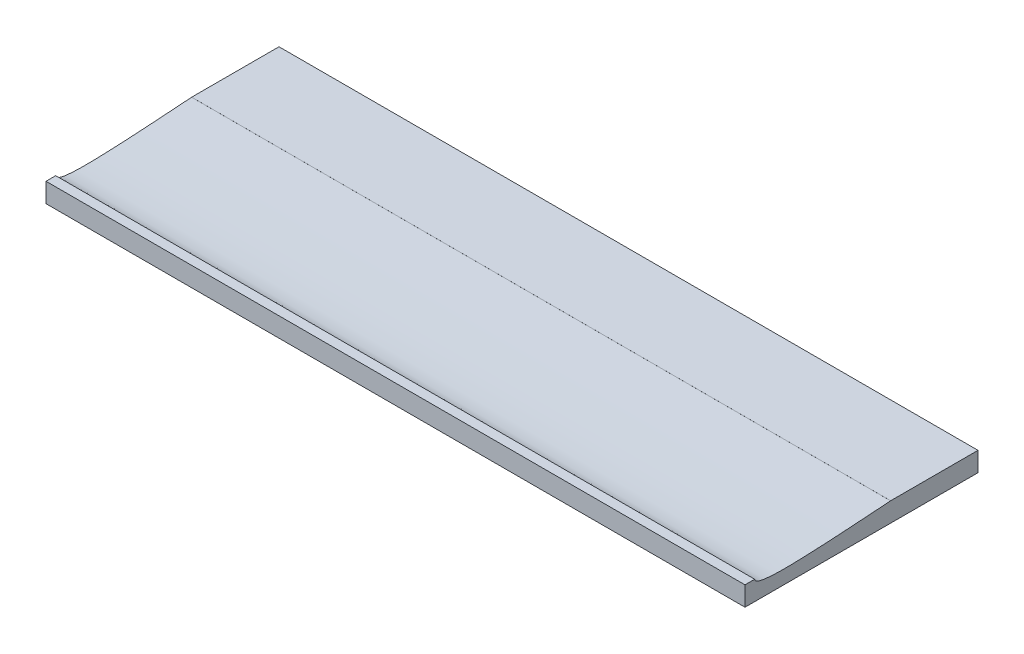
ISO-10303-21;
HEADER;
FILE_DESCRIPTION(('STEP AP214'),'2;1');
FILE_NAME('part.step','',(''),(''),'','','');
FILE_SCHEMA(('AUTOMOTIVE_DESIGN { 1 0 10303 214 1 1 1 1 }'));
ENDSEC;
DATA;
#1=APPLICATION_CONTEXT('core data for automotive mechanical design processes');
#2=APPLICATION_PROTOCOL_DEFINITION('international standard','automotive_design',2000,#1);
#3=PRODUCT_CONTEXT('',#1,'mechanical');
#4=PRODUCT('Part','Part','',(#3));
#5=PRODUCT_RELATED_PRODUCT_CATEGORY('part','',(#4));
#6=PRODUCT_DEFINITION_FORMATION('','',#4);
#7=PRODUCT_DEFINITION_CONTEXT('part definition',#1,'design');
#8=PRODUCT_DEFINITION('design','',#6,#7);
#9=PRODUCT_DEFINITION_SHAPE('','',#8);
#10=(LENGTH_UNIT() NAMED_UNIT(*) SI_UNIT(.MILLI.,.METRE.));
#11=(NAMED_UNIT(*) PLANE_ANGLE_UNIT() SI_UNIT($,.RADIAN.));
#12=(NAMED_UNIT(*) SI_UNIT($,.STERADIAN.) SOLID_ANGLE_UNIT());
#13=UNCERTAINTY_MEASURE_WITH_UNIT(LENGTH_MEASURE(1.E-05),#10,'distance_accuracy_value','');
#14=(GEOMETRIC_REPRESENTATION_CONTEXT(3) GLOBAL_UNCERTAINTY_ASSIGNED_CONTEXT((#13)) GLOBAL_UNIT_ASSIGNED_CONTEXT((#10,
#11,#12)) REPRESENTATION_CONTEXT('',''));
#15=CARTESIAN_POINT('',(0.,0.,0.));
#16=DIRECTION('',(0.,0.,1.));
#17=DIRECTION('',(1.,0.,0.));
#18=AXIS2_PLACEMENT_3D('',#15,#16,#17);
#19=CARTESIAN_POINT('',(0.,0.,0.));
#20=DIRECTION('',(0.,1.,0.));
#21=DIRECTION('',(0.,0.,1.));
#22=AXIS2_PLACEMENT_3D('',#19,#20,#21);
#23=PLANE('',#22);
#24=DIRECTION('',(0.,0.,1.));
#25=VECTOR('',#24,1.);
#26=CARTESIAN_POINT('',(-914.4,0.,0.));
#27=LINE('',#26,#25);
#28=CARTESIAN_POINT('',(-914.4,0.,0.));
#29=VERTEX_POINT('',#28);
#30=CARTESIAN_POINT('',(-914.4,0.,25.4));
#31=VERTEX_POINT('',#30);
#32=EDGE_CURVE('E176',#29,#31,#27,.T.);
#33=ORIENTED_EDGE('',*,*,#32,.T.);
#34=DIRECTION('',(1.,0.,0.));
#35=VECTOR('',#34,1.);
#36=CARTESIAN_POINT('',(914.4,0.,25.4));
#37=LINE('',#36,#35);
#38=CARTESIAN_POINT('',(914.4,0.,25.4));
#39=VERTEX_POINT('',#38);
#40=EDGE_CURVE('E174',#31,#39,#37,.T.);
#41=ORIENTED_EDGE('',*,*,#40,.T.);
#42=DIRECTION('',(0.,0.,1.));
#43=VECTOR('',#42,1.);
#44=CARTESIAN_POINT('',(914.4,0.,0.));
#45=LINE('',#44,#43);
#46=CARTESIAN_POINT('',(914.4,0.,0.));
#47=VERTEX_POINT('',#46);
#48=EDGE_CURVE('E90',#47,#39,#45,.T.);
#49=ORIENTED_EDGE('',*,*,#48,.F.);
#50=DIRECTION('',(-1.,0.,0.));
#51=VECTOR('',#50,1.);
#52=CARTESIAN_POINT('',(914.4,0.,0.));
#53=LINE('',#52,#51);
#54=EDGE_CURVE('E108',#29,#47,#53,.F.);
#55=ORIENTED_EDGE('',*,*,#54,.F.);
#56=EDGE_LOOP('',(#33,#41,#49,#55));
#57=FACE_BOUND('',#56,.T.);
#58=ADVANCED_FACE('F43',(#57),#23,.T.);
#59=CARTESIAN_POINT('',(914.4,0.,-584.2));
#60=VERTEX_POINT('',#59);
#61=CARTESIAN_POINT('',(914.4,0.,-355.6));
#62=VERTEX_POINT('',#61);
#63=EDGE_CURVE('E159',#60,#62,#45,.T.);
#64=ORIENTED_EDGE('',*,*,#63,.F.);
#65=DIRECTION('',(-1.,0.,0.));
#66=VECTOR('',#65,1.);
#67=CARTESIAN_POINT('',(914.4,0.,-584.2));
#68=LINE('',#67,#66);
#69=CARTESIAN_POINT('',(-914.4,0.,-584.2));
#70=VERTEX_POINT('',#69);
#71=EDGE_CURVE('E163',#60,#70,#68,.T.);
#72=ORIENTED_EDGE('',*,*,#71,.T.);
#73=CARTESIAN_POINT('',(-914.4,0.,-355.6));
#74=VERTEX_POINT('',#73);
#75=EDGE_CURVE('E169',#70,#74,#27,.T.);
#76=ORIENTED_EDGE('',*,*,#75,.T.);
#77=DIRECTION('',(-1.,0.,0.));
#78=VECTOR('',#77,1.);
#79=CARTESIAN_POINT('',(914.4,0.,-355.6));
#80=LINE('',#79,#78);
#81=EDGE_CURVE('E104',#62,#74,#80,.T.);
#82=ORIENTED_EDGE('',*,*,#81,.F.);
#83=EDGE_LOOP('',(#64,#72,#76,#82));
#84=FACE_BOUND('',#83,.T.);
#85=ADVANCED_FACE('F137',(#84),#23,.T.);
#86=CARTESIAN_POINT('',(914.4,-50.8,25.4));
#87=DIRECTION('',(0.,1.,0.));
#88=DIRECTION('',(0.,0.,1.));
#89=AXIS2_PLACEMENT_3D('',#86,#87,#88);
#90=PLANE('',#89);
#91=DIRECTION('',(0.,0.,-1.));
#92=VECTOR('',#91,1.);
#93=CARTESIAN_POINT('',(-914.4,-50.8,25.4));
#94=LINE('',#93,#92);
#95=CARTESIAN_POINT('',(-914.4,-50.8,25.4));
#96=VERTEX_POINT('',#95);
#97=CARTESIAN_POINT('',(-914.4,-50.8,-584.2));
#98=VERTEX_POINT('',#97);
#99=EDGE_CURVE('E111',#96,#98,#94,.T.);
#100=ORIENTED_EDGE('',*,*,#99,.T.);
#101=DIRECTION('',(-1.,0.,0.));
#102=VECTOR('',#101,1.);
#103=CARTESIAN_POINT('',(914.4,-50.8,-584.2));
#104=LINE('',#103,#102);
#105=CARTESIAN_POINT('',(914.4,-50.8,-584.2));
#106=VERTEX_POINT('',#105);
#107=EDGE_CURVE('E99',#106,#98,#104,.T.);
#108=ORIENTED_EDGE('',*,*,#107,.F.);
#109=DIRECTION('',(0.,0.,-1.));
#110=VECTOR('',#109,1.);
#111=CARTESIAN_POINT('',(914.4,-50.8,25.4));
#112=LINE('',#111,#110);
#113=CARTESIAN_POINT('',(914.4,-50.8,25.4));
#114=VERTEX_POINT('',#113);
#115=EDGE_CURVE('E85',#114,#106,#112,.T.);
#116=ORIENTED_EDGE('',*,*,#115,.F.);
#117=DIRECTION('',(-1.,0.,0.));
#118=VECTOR('',#117,1.);
#119=CARTESIAN_POINT('',(914.4,-50.8,25.4));
#120=LINE('',#119,#118);
#121=EDGE_CURVE('E97',#114,#96,#120,.T.);
#122=ORIENTED_EDGE('',*,*,#121,.T.);
#123=EDGE_LOOP('',(#100,#108,#116,#122));
#124=FACE_BOUND('',#123,.T.);
#125=ADVANCED_FACE('F96',(#124),#90,.F.);
#126=CARTESIAN_POINT('',(914.4,0.0888999932646485,-355.599995778429));
#127=CARTESIAN_POINT('',(914.4,0.484485581174474,-353.719919627978));
#128=CARTESIAN_POINT('',(914.4,1.27499422878835,-349.962916085565));
#129=CARTESIAN_POINT('',(914.4,2.40827403380004,-344.321357203808));
#130=CARTESIAN_POINT('',(914.4,3.51224428554685,-338.683668582805));
#131=CARTESIAN_POINT('',(914.4,4.58778598690869,-333.050236725864));
#132=CARTESIAN_POINT('',(914.4,5.63943265471717,-327.422693692191));
#133=CARTESIAN_POINT('',(914.4,6.66885796095019,-321.802334741478));
#134=CARTESIAN_POINT('',(914.4,8.01138509570149,-314.329135268456));
#135=CARTESIAN_POINT('',(914.4,9.95842272173463,-303.170369870886));
#136=CARTESIAN_POINT('',(914.4,12.1073580768191,-290.19428736061));
#137=CARTESIAN_POINT('',(914.4,14.1187486911346,-277.289771757418));
#138=CARTESIAN_POINT('',(914.4,15.7391510638879,-266.32724231001));
#139=CARTESIAN_POINT('',(914.4,17.7534444628226,-251.907291760423));
#140=CARTESIAN_POINT('',(914.4,19.5782384305861,-237.620805882297));
#141=CARTESIAN_POINT('',(914.4,21.2212030126759,-223.484571154683));
#142=CARTESIAN_POINT('',(914.4,22.3524467404894,-213.079958676204));
#143=CARTESIAN_POINT('',(914.4,23.3907772480329,-202.818953541216));
#144=CARTESIAN_POINT('',(914.4,24.3352201311702,-192.711844060908));
#145=CARTESIAN_POINT('',(914.4,25.1831580524957,-182.768771906038));
#146=CARTESIAN_POINT('',(914.4,25.9306382458563,-172.999706974309));
#147=CARTESIAN_POINT('',(914.4,26.6759749048506,-161.875503699859));
#148=CARTESIAN_POINT('',(914.4,27.3461189359201,-149.491704209398));
#149=CARTESIAN_POINT('',(914.4,27.8403999086836,-135.95080921462));
#150=CARTESIAN_POINT('',(914.4,28.0598914946158,-122.90686374129));
#151=CARTESIAN_POINT('',(914.4,28.000634334178,-110.389557420167));
#152=CARTESIAN_POINT('',(914.4,27.7009853530257,-99.6722079382337));
#153=CARTESIAN_POINT('',(914.4,27.2622927992727,-90.6679719817907));
#154=CARTESIAN_POINT('',(914.4,26.7758575923483,-83.2799929778685));
#155=CARTESIAN_POINT('',(914.4,26.1810853849601,-76.1661794314949));
#156=CARTESIAN_POINT('',(914.4,25.4836516885047,-69.3336988676735));
#157=CARTESIAN_POINT('',(914.4,24.689671340475,-62.7894248802562));
#158=CARTESIAN_POINT('',(914.4,23.8055575461834,-56.5399161880709));
#159=CARTESIAN_POINT('',(914.4,22.8379106465937,-50.5914339032072));
#160=CARTESIAN_POINT('',(914.4,21.7934994750107,-44.9499525321036));
#161=CARTESIAN_POINT('',(914.4,20.6792785482356,-39.6211129124822));
#162=CARTESIAN_POINT('',(914.4,19.6842791067834,-35.3845979102347));
#163=CARTESIAN_POINT('',(914.4,18.666344517664,-31.4108424021032));
#164=CARTESIAN_POINT('',(914.4,17.8281037816429,-28.3940365304039));
#165=CARTESIAN_POINT('',(914.4,16.9507508081887,-25.4941647933605));
#166=CARTESIAN_POINT('',(914.4,16.2934917856738,-23.4386817147605));
#167=CARTESIAN_POINT('',(914.4,15.626915768883,-21.4667801099441));
#168=CARTESIAN_POINT('',(914.4,14.9519127394029,-19.5789527007116));
#169=CARTESIAN_POINT('',(914.4,14.2693659035436,-17.7756646059748));
#170=CARTESIAN_POINT('',(914.4,13.5801227217627,-16.0573627919274));
#171=CARTESIAN_POINT('',(914.4,12.8850105112396,-14.4244662360696));
#172=CARTESIAN_POINT('',(914.4,12.184822001138,-12.8773705758602));
#173=CARTESIAN_POINT('',(914.4,11.4802931460051,-11.4164542302671));
#174=CARTESIAN_POINT('',(914.4,10.7721404320471,-10.042056179485));
#175=CARTESIAN_POINT('',(914.4,10.0609840538432,-8.75451140864337));
#176=CARTESIAN_POINT('',(914.4,9.34742586365131,-7.55410741535457));
#177=CARTESIAN_POINT('',(914.4,8.63197657385887,-6.44111986265641));
#178=CARTESIAN_POINT('',(914.4,7.91507972654084,-5.41579304086776));
#179=CARTESIAN_POINT('',(914.4,7.19710726143535,-4.47834590859567));
#180=CARTESIAN_POINT('',(914.4,6.47834398840472,-3.62897649230648));
#181=CARTESIAN_POINT('',(914.4,5.75899167458045,-2.8678645613673));
#182=CARTESIAN_POINT('',(914.4,5.03915146014301,-2.19519016488507));
#183=CARTESIAN_POINT('',(914.4,4.3188450256708,-1.61113349513031));
#184=CARTESIAN_POINT('',(914.4,3.59800480984628,-1.11592131301051));
#185=CARTESIAN_POINT('',(914.4,2.87650932958446,-0.709825307374234));
#186=CARTESIAN_POINT('',(914.4,2.15423770956035,-0.393271270910302));
#187=CARTESIAN_POINT('',(914.4,1.43114641284214,-0.166504253705502));
#188=CARTESIAN_POINT('',(914.4,0.707331330915151,-0.0307376439622371));
#189=CARTESIAN_POINT('',(914.4,0.00232932620353329,0.0151098098380154));
#190=CARTESIAN_POINT('',(914.4,-0.683215048159153,-0.0301037116403786));
#191=CARTESIAN_POINT('',(914.4,-1.34695958712753,-0.166757282954507));
#192=CARTESIAN_POINT('',(914.4,-2.00572291465681,-0.393300202169732));
#193=CARTESIAN_POINT('',(914.4,-2.65730372587272,-0.709982050953246));
#194=CARTESIAN_POINT('',(914.4,-3.2997623836231,-1.11618132805993));
#195=CARTESIAN_POINT('',(914.4,-3.9313651106067,-1.6115836285801));
#196=CARTESIAN_POINT('',(914.4,-4.55054106118055,-2.1958867596998));
#197=CARTESIAN_POINT('',(914.4,-5.15587344409194,-2.86885359516217));
#198=CARTESIAN_POINT('',(914.4,-5.74607207417029,-3.63028452229133));
#199=CARTESIAN_POINT('',(914.4,-6.31998901706061,-4.47999028296817));
#200=CARTESIAN_POINT('',(914.4,-6.87661798278696,-5.417778420158));
#201=CARTESIAN_POINT('',(914.4,-7.41511817899515,-6.44344047617879));
#202=CARTESIAN_POINT('',(914.4,-7.93480995423522,-7.55674632750534));
#203=CARTESIAN_POINT('',(914.4,-8.43516226683319,-8.75745060156426));
#204=CARTESIAN_POINT('',(914.4,-8.91581846169906,-10.0452727397741));
#205=CARTESIAN_POINT('',(914.4,-9.37654439061302,-11.4199183315632));
#206=CARTESIAN_POINT('',(914.4,-9.81727901053021,-12.8810564986875));
#207=CARTESIAN_POINT('',(914.4,-10.2380485633599,-14.4283426835293));
#208=CARTESIAN_POINT('',(914.4,-10.6390088315133,-16.0614015336329));
#209=CARTESIAN_POINT('',(914.4,-11.0203911753756,-17.7798373710803));
#210=CARTESIAN_POINT('',(914.4,-11.3825035072084,-19.5832301494774));
#211=CARTESIAN_POINT('',(914.4,-11.7256904598538,-21.4711382030198));
#212=CARTESIAN_POINT('',(914.4,-12.050327434657,-23.4430966970589));
#213=CARTESIAN_POINT('',(914.4,-12.3568180216669,-25.4986158577295));
#214=CARTESIAN_POINT('',(914.4,-12.645541453721,-27.6371867964413));
#215=CARTESIAN_POINT('',(914.4,-12.9168636238968,-29.8582780757741));
#216=CARTESIAN_POINT('',(914.4,-13.171121780276,-32.161337168058));
#217=CARTESIAN_POINT('',(914.4,-13.4929712463794,-35.3928718711518));
#218=CARTESIAN_POINT('',(914.4,-13.8511273672977,-39.6335154909436));
#219=CARTESIAN_POINT('',(914.4,-14.2099335232274,-44.9616803141279));
#220=CARTESIAN_POINT('',(914.4,-14.5049014533192,-50.6024317882962));
#221=CARTESIAN_POINT('',(914.4,-14.7360487741375,-56.550155093403));
#222=CARTESIAN_POINT('',(914.4,-14.9032149717867,-62.7988886868957));
#223=CARTESIAN_POINT('',(914.4,-15.0064225630524,-69.342369228511));
#224=CARTESIAN_POINT('',(914.4,-15.0462941548851,-76.1740243212016));
#225=CARTESIAN_POINT('',(914.4,-15.0243336308451,-83.2869671715745));
#226=CARTESIAN_POINT('',(914.4,-14.943132188672,-90.6740259312473));
#227=CARTESIAN_POINT('',(914.4,-14.8063203976315,-98.3277605740099));
#228=CARTESIAN_POINT('',(914.4,-14.618358338504,-106.240488655173));
#229=CARTESIAN_POINT('',(914.4,-14.384158224907,-114.404261408505));
#230=CARTESIAN_POINT('',(914.4,-14.1085883948963,-122.810873498885));
#231=CARTESIAN_POINT('',(914.4,-13.795890052846,-131.451881899253));
#232=CARTESIAN_POINT('',(914.4,-13.4492392711255,-140.31860440387));
#233=CARTESIAN_POINT('',(914.4,-13.070337508655,-149.402126746701));
#234=CARTESIAN_POINT('',(914.4,-12.5165058961395,-161.921237988967));
#235=CARTESIAN_POINT('',(914.4,-11.9011593810326,-174.697664723599));
#236=CARTESIAN_POINT('',(914.4,-11.2171089948709,-187.718132988968));
#237=CARTESIAN_POINT('',(914.4,-10.6596020882973,-197.744296345408));
#238=CARTESIAN_POINT('',(914.4,-10.0623466520962,-207.929345734514));
#239=CARTESIAN_POINT('',(914.4,-9.31920764222235,-220.025511724724));
#240=CARTESIAN_POINT('',(914.4,-8.53057328007864,-232.279253588705));
#241=CARTESIAN_POINT('',(914.4,-7.71271343755829,-244.678709307049));
#242=CARTESIAN_POINT('',(914.4,-6.99693210166396,-255.44982581504));
#243=CARTESIAN_POINT('',(914.4,-6.39751252609224,-264.490823063697));
#244=CARTESIAN_POINT('',(914.4,-5.79620806929575,-273.609082441259));
#245=CARTESIAN_POINT('',(914.4,-5.19363615367616,-282.795452689038));
#246=CARTESIAN_POINT('',(914.4,-4.46750228310593,-293.87201072249));
#247=CARTESIAN_POINT('',(914.4,-3.85089002174569,-303.143053310773));
#248=CARTESIAN_POINT('',(914.4,-3.343108159663,-310.587934230327));
#249=CARTESIAN_POINT('',(914.4,-2.95303735993374,-316.189704639656));
#250=CARTESIAN_POINT('',(914.4,-2.55308304470998,-321.801365045513));
#251=CARTESIAN_POINT('',(914.4,-2.14302939620148,-327.421479554197));
#252=CARTESIAN_POINT('',(914.4,-1.72426808071623,-333.048603174085));
#253=CARTESIAN_POINT('',(914.4,-1.29990899265731,-338.681282887829));
#254=CARTESIAN_POINT('',(914.4,-0.877582286593762,-344.318125247312));
#255=CARTESIAN_POINT('',(914.4,-0.463228732567428,-349.957440029158));
#256=CARTESIAN_POINT('',(914.4,-0.213672512160036,-353.719205679018));
#257=CARTESIAN_POINT('',(914.4,-0.0888999932646483,-355.600004221571));
#258=B_SPLINE_CURVE_WITH_KNOTS('',3,(#126,#127,#128,#129,#130,#131,#132,#133,#134,#135,#136,
#137,#138,#139,#140,#141,#142,#143,#144,#145,#146,#147,#148,#149,#150,#151,#152,#153,#154,#155,
#156,#157,#158,#159,#160,#161,#162,#163,#164,#165,#166,#167,#168,#169,#170,#171,#172,#173,#174,
#175,#176,#177,#178,#179,#180,#181,#182,#183,#184,#185,#186,#187,#188,#189,#190,#191,#192,#193,
#194,#195,#196,#197,#198,#199,#200,#201,#202,#203,#204,#205,#206,#207,#208,#209,#210,#211,#212,
#213,#214,#215,#216,#217,#218,#219,#220,#221,#222,#223,#224,#225,#226,#227,#228,#229,#230,#231,
#232,#233,#234,#235,#236,#237,#238,#239,#240,#241,#242,#243,#244,#245,#246,#247,#248,#249,#250,
#251,#252,#253,#254,#255,#256,#257),.UNSPECIFIED.,.F.,.F.,(4,1,1,1,1,1,1,1,1,1,1,1,1,1,1,1,1,1,
1,1,1,1,1,1,1,1,1,1,1,1,1,1,1,1,1,1,1,1,1,1,1,1,1,1,1,1,1,1,1,1,1,1,1,1,1,1,1,1,1,1,1,1,1,1,1,1,
1,1,1,1,1,1,1,1,1,1,1,1,1,1,1,1,1,1,1,1,1,1,1,1,1,1,1,1,1,1,1,1,1,1,1,1,1,1,1,1,1,1,1,1,1,1,1,1,
1,1,1,1,1,1,1,1,1,1,1,1,1,1,1,4),(0.,0.00794054253800827,0.0158677862260044,0.0237823355295012,
0.0316838418205309,0.0395714657177212,0.0474438053438306,0.0552994066495223,0.0709529074253012,
0.0942599656642179,0.109659748759335,0.124931367508802,0.140060474948947,0.16983616684281,
0.184455938035171,0.198878987847676,0.213091980808253,0.227081363790371,0.24083373334847,
0.254335896346066,0.267574897796778,0.286913018185408,0.305591757157393,0.323574750969682,
0.340828861994365,0.357323531066317,0.367884026456488,0.378086461731641,0.387923234082839,
0.397387015236196,0.406470797189749,0.415167950389097,0.423472243631592,0.431377770088885,
0.438879021724844,0.445971138884747,0.449362330648294,0.455832514431191,0.458910652184174,
0.461883669269834,0.464751272019807,0.467513247226822,0.470169459050699,0.472719871771161,
0.475164566874604,0.477503761569343,0.479737826283505,0.48186733255789,0.483893083712124,
0.485816151684372,0.487637951221375,0.489360302772708,0.490985530021076,0.492516542176065,
0.49395700356015,0.495311466006948,0.496585560552849,0.497786200428971,0.49892178695692,
0.500002352220144,0.501039639811119,0.502046986670077,0.503038994908549,0.503951730837978,
0.504878158030601,0.505831392661311,0.506823575724639,0.507865603008109,0.508967031971782,
0.510136106550442,0.511379884791428,0.512704371017619,0.514114660263003,0.51561509311769,
0.517209348446535,0.518900571097045,0.520691418544469,0.52258414386721,0.524580637882838,
0.526682477749363,0.528890963833217,0.531207133212725,0.533631806027993,0.536165598839476,
0.538808937253662,0.541562081086993,0.544425146730385,0.54739810801092,0.550480817074069,
0.553673026528163,0.556974385201834,0.563902733135108,0.571261380888569,0.579045037483656,
0.587247420068503,0.595861594725327,0.604880098032451,0.614294871054451,0.624097260748233,
0.634278055645911,0.644827521987638,0.655735355300336,0.666990798757914,0.678582536023013,
0.690498842724987,0.702727788654271,0.715257041549763,0.728074047062697,0.75452037740322,
0.768123570697866,0.781962351074077,0.79602290449003,0.810291084820141,0.832050541345135,
0.84677287440772,0.861649926398845,0.876666218949297,0.884221742698137,0.899417940676313,
0.914715475207486,0.930099899620206,0.937820202466263,0.94555696886631,0.953308312238934,
0.961072258877045,0.96884687873477,0.976629764477321,0.984418333857866,0.992209516036237,1.),.UNSPECIFIED.);
#259=DIRECTION('',(-1.,0.,0.));
#260=VECTOR('',#259,1.);
#261=SURFACE_OF_LINEAR_EXTRUSION('',#258,#260);
#262=CARTESIAN_POINT('',(-914.4,0.0888999932646485,-355.599995778429));
#263=CARTESIAN_POINT('',(-914.4,0.484485581174474,-353.719919627978));
#264=CARTESIAN_POINT('',(-914.4,1.27499422878835,-349.962916085565));
#265=CARTESIAN_POINT('',(-914.4,2.40827403380004,-344.321357203808));
#266=CARTESIAN_POINT('',(-914.4,3.51224428554685,-338.683668582805));
#267=CARTESIAN_POINT('',(-914.4,4.58778598690869,-333.050236725864));
#268=CARTESIAN_POINT('',(-914.4,5.63943265471717,-327.422693692191));
#269=CARTESIAN_POINT('',(-914.4,6.66885796095019,-321.802334741478));
#270=CARTESIAN_POINT('',(-914.4,8.01138509570149,-314.329135268456));
#271=CARTESIAN_POINT('',(-914.4,9.95842272173463,-303.170369870886));
#272=CARTESIAN_POINT('',(-914.4,12.1073580768191,-290.19428736061));
#273=CARTESIAN_POINT('',(-914.4,14.1187486911346,-277.289771757418));
#274=CARTESIAN_POINT('',(-914.4,15.7391510638879,-266.32724231001));
#275=CARTESIAN_POINT('',(-914.4,17.7534444628226,-251.907291760423));
#276=CARTESIAN_POINT('',(-914.4,19.5782384305861,-237.620805882297));
#277=CARTESIAN_POINT('',(-914.4,21.2212030126759,-223.484571154683));
#278=CARTESIAN_POINT('',(-914.4,22.3524467404894,-213.079958676204));
#279=CARTESIAN_POINT('',(-914.4,23.3907772480329,-202.818953541216));
#280=CARTESIAN_POINT('',(-914.4,24.3352201311702,-192.711844060908));
#281=CARTESIAN_POINT('',(-914.4,25.1831580524957,-182.768771906038));
#282=CARTESIAN_POINT('',(-914.4,25.9306382458563,-172.999706974309));
#283=CARTESIAN_POINT('',(-914.4,26.6759749048506,-161.875503699859));
#284=CARTESIAN_POINT('',(-914.4,27.3461189359201,-149.491704209398));
#285=CARTESIAN_POINT('',(-914.4,27.8403999086836,-135.95080921462));
#286=CARTESIAN_POINT('',(-914.4,28.0598914946158,-122.90686374129));
#287=CARTESIAN_POINT('',(-914.4,28.000634334178,-110.389557420167));
#288=CARTESIAN_POINT('',(-914.4,27.7009853530257,-99.6722079382337));
#289=CARTESIAN_POINT('',(-914.4,27.2622927992727,-90.6679719817907));
#290=CARTESIAN_POINT('',(-914.4,26.7758575923483,-83.2799929778685));
#291=CARTESIAN_POINT('',(-914.4,26.1810853849601,-76.1661794314949));
#292=CARTESIAN_POINT('',(-914.4,25.4836516885047,-69.3336988676735));
#293=CARTESIAN_POINT('',(-914.4,24.689671340475,-62.7894248802562));
#294=CARTESIAN_POINT('',(-914.4,23.8055575461834,-56.5399161880709));
#295=CARTESIAN_POINT('',(-914.4,22.8379106465937,-50.5914339032072));
#296=CARTESIAN_POINT('',(-914.4,21.7934994750107,-44.9499525321036));
#297=CARTESIAN_POINT('',(-914.4,20.6792785482356,-39.6211129124822));
#298=CARTESIAN_POINT('',(-914.4,19.6842791067834,-35.3845979102347));
#299=CARTESIAN_POINT('',(-914.4,18.666344517664,-31.4108424021032));
#300=CARTESIAN_POINT('',(-914.4,17.8281037816429,-28.3940365304039));
#301=CARTESIAN_POINT('',(-914.4,16.9507508081887,-25.4941647933605));
#302=CARTESIAN_POINT('',(-914.4,16.2934917856738,-23.4386817147605));
#303=CARTESIAN_POINT('',(-914.4,15.626915768883,-21.4667801099441));
#304=CARTESIAN_POINT('',(-914.4,14.9519127394029,-19.5789527007116));
#305=CARTESIAN_POINT('',(-914.4,14.2693659035436,-17.7756646059748));
#306=CARTESIAN_POINT('',(-914.4,13.5801227217627,-16.0573627919274));
#307=CARTESIAN_POINT('',(-914.4,12.8850105112396,-14.4244662360696));
#308=CARTESIAN_POINT('',(-914.4,12.184822001138,-12.8773705758602));
#309=CARTESIAN_POINT('',(-914.4,11.4802931460051,-11.4164542302671));
#310=CARTESIAN_POINT('',(-914.4,10.7721404320471,-10.042056179485));
#311=CARTESIAN_POINT('',(-914.4,10.0609840538432,-8.75451140864337));
#312=CARTESIAN_POINT('',(-914.4,9.34742586365131,-7.55410741535457));
#313=CARTESIAN_POINT('',(-914.4,8.63197657385887,-6.44111986265641));
#314=CARTESIAN_POINT('',(-914.4,7.91507972654084,-5.41579304086776));
#315=CARTESIAN_POINT('',(-914.4,7.19710726143535,-4.47834590859567));
#316=CARTESIAN_POINT('',(-914.4,6.47834398840472,-3.62897649230648));
#317=CARTESIAN_POINT('',(-914.4,5.75899167458045,-2.8678645613673));
#318=CARTESIAN_POINT('',(-914.4,5.03915146014301,-2.19519016488507));
#319=CARTESIAN_POINT('',(-914.4,4.3188450256708,-1.61113349513031));
#320=CARTESIAN_POINT('',(-914.4,3.59800480984628,-1.11592131301051));
#321=CARTESIAN_POINT('',(-914.4,2.87650932958446,-0.709825307374234));
#322=CARTESIAN_POINT('',(-914.4,2.15423770956035,-0.393271270910302));
#323=CARTESIAN_POINT('',(-914.4,1.43114641284214,-0.166504253705502));
#324=CARTESIAN_POINT('',(-914.4,0.707331330915151,-0.0307376439622371));
#325=CARTESIAN_POINT('',(-914.4,0.00232932620353329,0.0151098098380154));
#326=CARTESIAN_POINT('',(-914.4,-0.683215048159153,-0.0301037116403786));
#327=CARTESIAN_POINT('',(-914.4,-1.34695958712753,-0.166757282954507));
#328=CARTESIAN_POINT('',(-914.4,-2.00572291465681,-0.393300202169732));
#329=CARTESIAN_POINT('',(-914.4,-2.65730372587272,-0.709982050953246));
#330=CARTESIAN_POINT('',(-914.4,-3.2997623836231,-1.11618132805993));
#331=CARTESIAN_POINT('',(-914.4,-3.9313651106067,-1.6115836285801));
#332=CARTESIAN_POINT('',(-914.4,-4.55054106118055,-2.1958867596998));
#333=CARTESIAN_POINT('',(-914.4,-5.15587344409194,-2.86885359516217));
#334=CARTESIAN_POINT('',(-914.4,-5.74607207417029,-3.63028452229133));
#335=CARTESIAN_POINT('',(-914.4,-6.31998901706061,-4.47999028296817));
#336=CARTESIAN_POINT('',(-914.4,-6.87661798278696,-5.417778420158));
#337=CARTESIAN_POINT('',(-914.4,-7.41511817899515,-6.44344047617879));
#338=CARTESIAN_POINT('',(-914.4,-7.93480995423522,-7.55674632750534));
#339=CARTESIAN_POINT('',(-914.4,-8.43516226683319,-8.75745060156426));
#340=CARTESIAN_POINT('',(-914.4,-8.91581846169906,-10.0452727397741));
#341=CARTESIAN_POINT('',(-914.4,-9.37654439061302,-11.4199183315632));
#342=CARTESIAN_POINT('',(-914.4,-9.81727901053021,-12.8810564986875));
#343=CARTESIAN_POINT('',(-914.4,-10.2380485633599,-14.4283426835293));
#344=CARTESIAN_POINT('',(-914.4,-10.6390088315133,-16.0614015336329));
#345=CARTESIAN_POINT('',(-914.4,-11.0203911753756,-17.7798373710803));
#346=CARTESIAN_POINT('',(-914.4,-11.3825035072084,-19.5832301494774));
#347=CARTESIAN_POINT('',(-914.4,-11.7256904598538,-21.4711382030198));
#348=CARTESIAN_POINT('',(-914.4,-12.050327434657,-23.4430966970589));
#349=CARTESIAN_POINT('',(-914.4,-12.3568180216669,-25.4986158577295));
#350=CARTESIAN_POINT('',(-914.4,-12.645541453721,-27.6371867964413));
#351=CARTESIAN_POINT('',(-914.4,-12.9168636238968,-29.8582780757741));
#352=CARTESIAN_POINT('',(-914.4,-13.171121780276,-32.161337168058));
#353=CARTESIAN_POINT('',(-914.4,-13.4929712463794,-35.3928718711518));
#354=CARTESIAN_POINT('',(-914.4,-13.8511273672977,-39.6335154909436));
#355=CARTESIAN_POINT('',(-914.4,-14.2099335232274,-44.9616803141279));
#356=CARTESIAN_POINT('',(-914.4,-14.5049014533192,-50.6024317882962));
#357=CARTESIAN_POINT('',(-914.4,-14.7360487741375,-56.550155093403));
#358=CARTESIAN_POINT('',(-914.4,-14.9032149717867,-62.7988886868957));
#359=CARTESIAN_POINT('',(-914.4,-15.0064225630524,-69.342369228511));
#360=CARTESIAN_POINT('',(-914.4,-15.0462941548851,-76.1740243212016));
#361=CARTESIAN_POINT('',(-914.4,-15.0243336308451,-83.2869671715745));
#362=CARTESIAN_POINT('',(-914.4,-14.943132188672,-90.6740259312473));
#363=CARTESIAN_POINT('',(-914.4,-14.8063203976315,-98.3277605740099));
#364=CARTESIAN_POINT('',(-914.4,-14.618358338504,-106.240488655173));
#365=CARTESIAN_POINT('',(-914.4,-14.384158224907,-114.404261408505));
#366=CARTESIAN_POINT('',(-914.4,-14.1085883948963,-122.810873498885));
#367=CARTESIAN_POINT('',(-914.4,-13.795890052846,-131.451881899253));
#368=CARTESIAN_POINT('',(-914.4,-13.4492392711255,-140.31860440387));
#369=CARTESIAN_POINT('',(-914.4,-13.070337508655,-149.402126746701));
#370=CARTESIAN_POINT('',(-914.4,-12.5165058961395,-161.921237988967));
#371=CARTESIAN_POINT('',(-914.4,-11.9011593810326,-174.697664723599));
#372=CARTESIAN_POINT('',(-914.4,-11.2171089948709,-187.718132988968));
#373=CARTESIAN_POINT('',(-914.4,-10.6596020882973,-197.744296345408));
#374=CARTESIAN_POINT('',(-914.4,-10.0623466520962,-207.929345734514));
#375=CARTESIAN_POINT('',(-914.4,-9.31920764222235,-220.025511724724));
#376=CARTESIAN_POINT('',(-914.4,-8.53057328007864,-232.279253588705));
#377=CARTESIAN_POINT('',(-914.4,-7.71271343755829,-244.678709307049));
#378=CARTESIAN_POINT('',(-914.4,-6.99693210166396,-255.44982581504));
#379=CARTESIAN_POINT('',(-914.4,-6.39751252609224,-264.490823063697));
#380=CARTESIAN_POINT('',(-914.4,-5.79620806929575,-273.609082441259));
#381=CARTESIAN_POINT('',(-914.4,-5.19363615367616,-282.795452689038));
#382=CARTESIAN_POINT('',(-914.4,-4.46750228310593,-293.87201072249));
#383=CARTESIAN_POINT('',(-914.4,-3.85089002174569,-303.143053310773));
#384=CARTESIAN_POINT('',(-914.4,-3.343108159663,-310.587934230327));
#385=CARTESIAN_POINT('',(-914.4,-2.95303735993374,-316.189704639656));
#386=CARTESIAN_POINT('',(-914.4,-2.55308304470998,-321.801365045513));
#387=CARTESIAN_POINT('',(-914.4,-2.14302939620148,-327.421479554197));
#388=CARTESIAN_POINT('',(-914.4,-1.72426808071623,-333.048603174085));
#389=CARTESIAN_POINT('',(-914.4,-1.29990899265731,-338.681282887829));
#390=CARTESIAN_POINT('',(-914.4,-0.877582286593762,-344.318125247312));
#391=CARTESIAN_POINT('',(-914.4,-0.463228732567428,-349.957440029158));
#392=CARTESIAN_POINT('',(-914.4,-0.213672512160036,-353.719205679018));
#393=CARTESIAN_POINT('',(-914.4,-0.0888999932646483,-355.600004221571));
#394=B_SPLINE_CURVE_WITH_KNOTS('',3,(#262,#263,#264,#265,#266,#267,#268,#269,#270,#271,#272,
#273,#274,#275,#276,#277,#278,#279,#280,#281,#282,#283,#284,#285,#286,#287,#288,#289,#290,#291,
#292,#293,#294,#295,#296,#297,#298,#299,#300,#301,#302,#303,#304,#305,#306,#307,#308,#309,#310,
#311,#312,#313,#314,#315,#316,#317,#318,#319,#320,#321,#322,#323,#324,#325,#326,#327,#328,#329,
#330,#331,#332,#333,#334,#335,#336,#337,#338,#339,#340,#341,#342,#343,#344,#345,#346,#347,#348,
#349,#350,#351,#352,#353,#354,#355,#356,#357,#358,#359,#360,#361,#362,#363,#364,#365,#366,#367,
#368,#369,#370,#371,#372,#373,#374,#375,#376,#377,#378,#379,#380,#381,#382,#383,#384,#385,#386,
#387,#388,#389,#390,#391,#392,#393),.UNSPECIFIED.,.F.,.F.,(4,1,1,1,1,1,1,1,1,1,1,1,1,1,1,1,1,1,
1,1,1,1,1,1,1,1,1,1,1,1,1,1,1,1,1,1,1,1,1,1,1,1,1,1,1,1,1,1,1,1,1,1,1,1,1,1,1,1,1,1,1,1,1,1,1,1,
1,1,1,1,1,1,1,1,1,1,1,1,1,1,1,1,1,1,1,1,1,1,1,1,1,1,1,1,1,1,1,1,1,1,1,1,1,1,1,1,1,1,1,1,1,1,1,1,
1,1,1,1,1,1,1,1,1,1,1,1,1,1,1,4),(0.,0.00794054253800827,0.0158677862260044,0.0237823355295012,
0.0316838418205309,0.0395714657177212,0.0474438053438306,0.0552994066495223,0.0709529074253012,
0.0942599656642179,0.109659748759335,0.124931367508802,0.140060474948947,0.16983616684281,
0.184455938035171,0.198878987847676,0.213091980808253,0.227081363790371,0.24083373334847,
0.254335896346066,0.267574897796778,0.286913018185408,0.305591757157393,0.323574750969682,
0.340828861994365,0.357323531066317,0.367884026456488,0.378086461731641,0.387923234082839,
0.397387015236196,0.406470797189749,0.415167950389097,0.423472243631592,0.431377770088885,
0.438879021724844,0.445971138884747,0.449362330648294,0.455832514431191,0.458910652184174,
0.461883669269834,0.464751272019807,0.467513247226822,0.470169459050699,0.472719871771161,
0.475164566874604,0.477503761569343,0.479737826283505,0.48186733255789,0.483893083712124,
0.485816151684372,0.487637951221375,0.489360302772708,0.490985530021076,0.492516542176065,
0.49395700356015,0.495311466006948,0.496585560552849,0.497786200428971,0.49892178695692,
0.500002352220144,0.501039639811119,0.502046986670077,0.503038994908549,0.503951730837978,
0.504878158030601,0.505831392661311,0.506823575724639,0.507865603008109,0.508967031971782,
0.510136106550442,0.511379884791428,0.512704371017619,0.514114660263003,0.51561509311769,
0.517209348446535,0.518900571097045,0.520691418544469,0.52258414386721,0.524580637882838,
0.526682477749363,0.528890963833217,0.531207133212725,0.533631806027993,0.536165598839476,
0.538808937253662,0.541562081086993,0.544425146730385,0.54739810801092,0.550480817074069,
0.553673026528163,0.556974385201834,0.563902733135108,0.571261380888569,0.579045037483656,
0.587247420068503,0.595861594725327,0.604880098032451,0.614294871054451,0.624097260748233,
0.634278055645911,0.644827521987638,0.655735355300336,0.666990798757914,0.678582536023013,
0.690498842724987,0.702727788654271,0.715257041549763,0.728074047062697,0.75452037740322,
0.768123570697866,0.781962351074077,0.79602290449003,0.810291084820141,0.832050541345135,
0.84677287440772,0.861649926398845,0.876666218949297,0.884221742698137,0.899417940676313,
0.914715475207486,0.930099899620206,0.937820202466263,0.94555696886631,0.953308312238934,
0.961072258877045,0.96884687873477,0.976629764477321,0.984418333857866,0.992209516036237,1.),.UNSPECIFIED.);
#395=CARTESIAN_POINT('',(-914.4,-0.0888999932646484,-355.600004221571));
#396=VERTEX_POINT('',#395);
#397=EDGE_CURVE('E11',#29,#396,#394,.T.);
#398=ORIENTED_EDGE('',*,*,#397,.F.);
#399=ORIENTED_EDGE('',*,*,#54,.T.);
#400=CARTESIAN_POINT('',(914.4,-0.0888999932646484,-355.600004221571));
#401=VERTEX_POINT('',#400);
#402=EDGE_CURVE('E117',#47,#401,#258,.T.);
#403=ORIENTED_EDGE('',*,*,#402,.T.);
#404=DIRECTION('',(-1.,0.,0.));
#405=VECTOR('',#404,1.);
#406=CARTESIAN_POINT('',(914.4,-0.0888999932646484,-355.600004221571));
#407=LINE('',#406,#405);
#408=EDGE_CURVE('E113',#401,#396,#407,.T.);
#409=ORIENTED_EDGE('',*,*,#408,.T.);
#410=EDGE_LOOP('',(#398,#399,#403,#409));
#411=FACE_BOUND('',#410,.T.);
#412=ADVANCED_FACE('F126',(#411),#261,.T.);
#413=CARTESIAN_POINT('',(-914.4,0.,0.));
#414=DIRECTION('',(1.,0.,0.));
#415=DIRECTION('',(0.,0.,-1.));
#416=AXIS2_PLACEMENT_3D('',#413,#414,#415);
#417=PLANE('',#416);
#418=ORIENTED_EDGE('',*,*,#75,.F.);
#419=DIRECTION('',(0.,1.,0.));
#420=VECTOR('',#419,1.);
#421=CARTESIAN_POINT('',(-914.4,50.8,-584.2));
#422=LINE('',#421,#420);
#423=EDGE_CURVE('E92',#98,#70,#422,.T.);
#424=ORIENTED_EDGE('',*,*,#423,.F.);
#425=ORIENTED_EDGE('',*,*,#99,.F.);
#426=DIRECTION('',(0.,-1.,0.));
#427=VECTOR('',#426,1.);
#428=CARTESIAN_POINT('',(-914.4,50.8,25.4));
#429=LINE('',#428,#427);
#430=EDGE_CURVE('E67',#31,#96,#429,.T.);
#431=ORIENTED_EDGE('',*,*,#430,.F.);
#432=ORIENTED_EDGE('',*,*,#32,.F.);
#433=ORIENTED_EDGE('',*,*,#397,.T.);
#434=DIRECTION('',(0.,0.999999998872505,4.74867368749079E-05));
#435=VECTOR('',#434,1.);
#436=CARTESIAN_POINT('',(-914.4,0.0888999932646484,-355.599995778429));
#437=LINE('',#436,#435);
#438=EDGE_CURVE('E53',#396,#74,#437,.T.);
#439=ORIENTED_EDGE('',*,*,#438,.T.);
#440=EDGE_LOOP('',(#418,#424,#425,#431,#432,#433,#439));
#441=FACE_BOUND('',#440,.T.);
#442=ADVANCED_FACE('F129',(#441),#417,.F.);
#443=CARTESIAN_POINT('',(914.4,0.,0.));
#444=DIRECTION('',(1.,0.,0.));
#445=DIRECTION('',(0.,0.,-1.));
#446=AXIS2_PLACEMENT_3D('',#443,#444,#445);
#447=PLANE('',#446);
#448=DIRECTION('',(0.,1.,0.));
#449=VECTOR('',#448,1.);
#450=CARTESIAN_POINT('',(914.4,50.8,-584.2));
#451=LINE('',#450,#449);
#452=EDGE_CURVE('E101',#106,#60,#451,.T.);
#453=ORIENTED_EDGE('',*,*,#452,.T.);
#454=ORIENTED_EDGE('',*,*,#63,.T.);
#455=DIRECTION('',(0.,0.999999998872505,4.74867368749079E-05));
#456=VECTOR('',#455,1.);
#457=CARTESIAN_POINT('',(914.4,0.0888999932646484,-355.599995778429));
#458=LINE('',#457,#456);
#459=EDGE_CURVE('E116',#401,#62,#458,.T.);
#460=ORIENTED_EDGE('',*,*,#459,.F.);
#461=ORIENTED_EDGE('',*,*,#402,.F.);
#462=ORIENTED_EDGE('',*,*,#48,.T.);
#463=DIRECTION('',(0.,-1.,0.));
#464=VECTOR('',#463,1.);
#465=CARTESIAN_POINT('',(914.4,50.8,25.4));
#466=LINE('',#465,#464);
#467=EDGE_CURVE('E81',#39,#114,#466,.T.);
#468=ORIENTED_EDGE('',*,*,#467,.T.);
#469=ORIENTED_EDGE('',*,*,#115,.T.);
#470=EDGE_LOOP('',(#453,#454,#460,#461,#462,#468,#469));
#471=FACE_BOUND('',#470,.T.);
#472=ADVANCED_FACE('F84',(#471),#447,.T.);
#473=CARTESIAN_POINT('',(914.4,0.0888999932646484,-355.599995778429));
#474=DIRECTION('',(0.,-4.74867368749079E-05,0.999999998872505));
#475=DIRECTION('',(0.,-0.999999998872505,-4.74867368749079E-05));
#476=AXIS2_PLACEMENT_3D('',#473,#474,#475);
#477=PLANE('',#476);
#478=ORIENTED_EDGE('',*,*,#459,.T.);
#479=ORIENTED_EDGE('',*,*,#81,.T.);
#480=ORIENTED_EDGE('',*,*,#438,.F.);
#481=ORIENTED_EDGE('',*,*,#408,.F.);
#482=EDGE_LOOP('',(#478,#479,#480,#481));
#483=FACE_BOUND('',#482,.T.);
#484=ADVANCED_FACE('F45',(#483),#477,.T.);
#485=CARTESIAN_POINT('',(914.4,50.8,-584.2));
#486=DIRECTION('',(0.,0.,1.));
#487=DIRECTION('',(1.,0.,0.));
#488=AXIS2_PLACEMENT_3D('',#485,#486,#487);
#489=PLANE('',#488);
#490=ORIENTED_EDGE('',*,*,#71,.F.);
#491=ORIENTED_EDGE('',*,*,#452,.F.);
#492=ORIENTED_EDGE('',*,*,#107,.T.);
#493=ORIENTED_EDGE('',*,*,#423,.T.);
#494=EDGE_LOOP('',(#490,#491,#492,#493));
#495=FACE_BOUND('',#494,.T.);
#496=ADVANCED_FACE('F131',(#495),#489,.F.);
#497=CARTESIAN_POINT('',(914.4,50.8,25.4));
#498=DIRECTION('',(0.,0.,-1.));
#499=DIRECTION('',(-1.,0.,0.));
#500=AXIS2_PLACEMENT_3D('',#497,#498,#499);
#501=PLANE('',#500);
#502=ORIENTED_EDGE('',*,*,#40,.F.);
#503=ORIENTED_EDGE('',*,*,#430,.T.);
#504=ORIENTED_EDGE('',*,*,#121,.F.);
#505=ORIENTED_EDGE('',*,*,#467,.F.);
#506=EDGE_LOOP('',(#502,#503,#504,#505));
#507=FACE_BOUND('',#506,.T.);
#508=ADVANCED_FACE('F103',(#507),#501,.F.);
#509=CLOSED_SHELL('',(#58,#85,#125,#412,#442,#472,#484,#496,#508));
#510=MANIFOLD_SOLID_BREP('B2',#509);
#511=ADVANCED_BREP_SHAPE_REPRESENTATION('',(#18,#510),#14);
#512=SHAPE_DEFINITION_REPRESENTATION(#9,#511);
ENDSEC;
END-ISO-10303-21;
